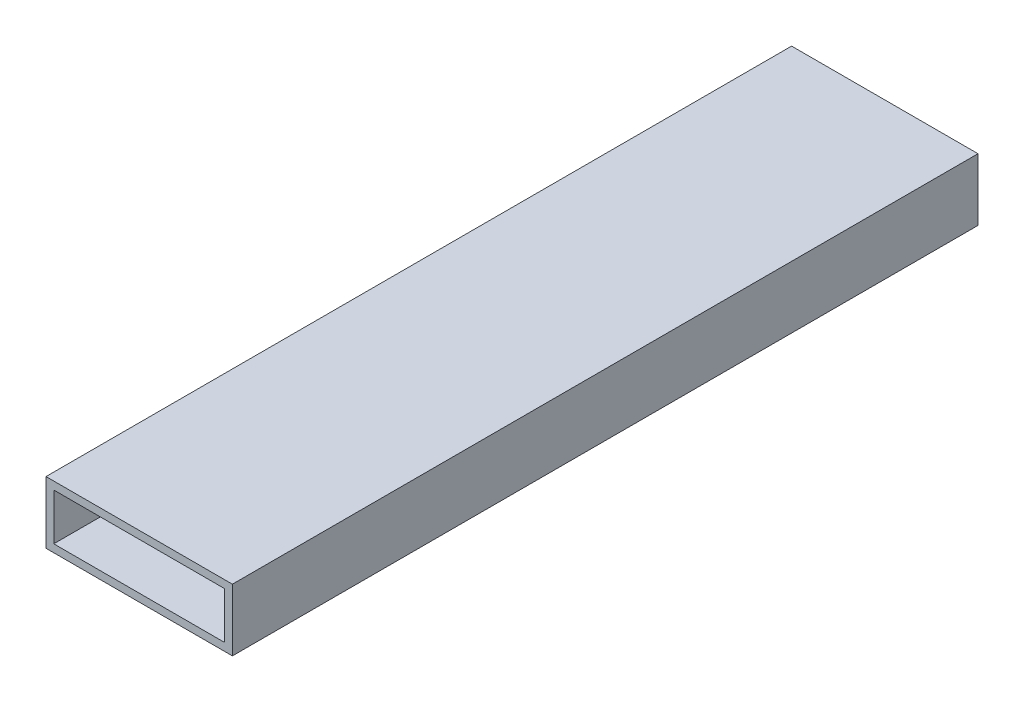
ISO-10303-21;
HEADER;
FILE_DESCRIPTION(('STEP AP214'),'2;1');
FILE_NAME('part.step','',(''),(''),'','','');
FILE_SCHEMA(('AUTOMOTIVE_DESIGN { 1 0 10303 214 1 1 1 1 }'));
ENDSEC;
DATA;
#1=APPLICATION_CONTEXT('core data for automotive mechanical design processes');
#2=APPLICATION_PROTOCOL_DEFINITION('international standard','automotive_design',2000,#1);
#3=PRODUCT_CONTEXT('',#1,'mechanical');
#4=PRODUCT('Part','Part','',(#3));
#5=PRODUCT_RELATED_PRODUCT_CATEGORY('part','',(#4));
#6=PRODUCT_DEFINITION_FORMATION('','',#4);
#7=PRODUCT_DEFINITION_CONTEXT('part definition',#1,'design');
#8=PRODUCT_DEFINITION('design','',#6,#7);
#9=PRODUCT_DEFINITION_SHAPE('','',#8);
#10=(LENGTH_UNIT() NAMED_UNIT(*) SI_UNIT(.MILLI.,.METRE.));
#11=(NAMED_UNIT(*) PLANE_ANGLE_UNIT() SI_UNIT($,.RADIAN.));
#12=(NAMED_UNIT(*) SI_UNIT($,.STERADIAN.) SOLID_ANGLE_UNIT());
#13=UNCERTAINTY_MEASURE_WITH_UNIT(LENGTH_MEASURE(1.E-05),#10,'distance_accuracy_value','');
#14=(GEOMETRIC_REPRESENTATION_CONTEXT(3) GLOBAL_UNCERTAINTY_ASSIGNED_CONTEXT((#13)) GLOBAL_UNIT_ASSIGNED_CONTEXT((#10,
#11,#12)) REPRESENTATION_CONTEXT('',''));
#15=CARTESIAN_POINT('',(0.,0.,0.));
#16=DIRECTION('',(0.,0.,1.));
#17=DIRECTION('',(1.,0.,0.));
#18=AXIS2_PLACEMENT_3D('',#15,#16,#17);
#19=CARTESIAN_POINT('',(38.1,12.7,-152.4));
#20=DIRECTION('',(1.,0.,0.));
#21=DIRECTION('',(0.,0.,-1.));
#22=AXIS2_PLACEMENT_3D('',#19,#20,#21);
#23=PLANE('',#22);
#24=DIRECTION('',(0.,1.,0.));
#25=VECTOR('',#24,1.);
#26=CARTESIAN_POINT('',(38.1,12.7,152.4));
#27=LINE('',#26,#25);
#28=CARTESIAN_POINT('',(38.1,-12.7,152.4));
#29=VERTEX_POINT('',#28);
#30=CARTESIAN_POINT('',(38.1,12.7,152.4));
#31=VERTEX_POINT('',#30);
#32=EDGE_CURVE('E129',#29,#31,#27,.T.);
#33=ORIENTED_EDGE('',*,*,#32,.F.);
#34=DIRECTION('',(0.,0.,1.));
#35=VECTOR('',#34,1.);
#36=CARTESIAN_POINT('',(38.1,-12.7,-152.4));
#37=LINE('',#36,#35);
#38=CARTESIAN_POINT('',(38.1,-12.7,-152.4));
#39=VERTEX_POINT('',#38);
#40=EDGE_CURVE('E11',#39,#29,#37,.T.);
#41=ORIENTED_EDGE('',*,*,#40,.F.);
#42=DIRECTION('',(0.,1.,0.));
#43=VECTOR('',#42,1.);
#44=CARTESIAN_POINT('',(38.1,12.7,-152.4));
#45=LINE('',#44,#43);
#46=CARTESIAN_POINT('',(38.1,12.7,-152.4));
#47=VERTEX_POINT('',#46);
#48=EDGE_CURVE('E133',#39,#47,#45,.T.);
#49=ORIENTED_EDGE('',*,*,#48,.T.);
#50=DIRECTION('',(0.,0.,1.));
#51=VECTOR('',#50,1.);
#52=CARTESIAN_POINT('',(38.1,12.7,-152.4));
#53=LINE('',#52,#51);
#54=EDGE_CURVE('E34',#47,#31,#53,.T.);
#55=ORIENTED_EDGE('',*,*,#54,.T.);
#56=EDGE_LOOP('',(#33,#41,#49,#55));
#57=FACE_BOUND('',#56,.T.);
#58=ADVANCED_FACE('F31',(#57),#23,.T.);
#59=CARTESIAN_POINT('',(-38.1,-12.7,-152.4));
#60=DIRECTION('',(0.,-1.,0.));
#61=DIRECTION('',(0.,0.,-1.));
#62=AXIS2_PLACEMENT_3D('',#59,#60,#61);
#63=PLANE('',#62);
#64=DIRECTION('',(1.,0.,0.));
#65=VECTOR('',#64,1.);
#66=CARTESIAN_POINT('',(-38.1,-12.7,152.4));
#67=LINE('',#66,#65);
#68=CARTESIAN_POINT('',(-38.1,-12.7,152.4));
#69=VERTEX_POINT('',#68);
#70=EDGE_CURVE('E137',#69,#29,#67,.T.);
#71=ORIENTED_EDGE('',*,*,#70,.F.);
#72=DIRECTION('',(0.,0.,1.));
#73=VECTOR('',#72,1.);
#74=CARTESIAN_POINT('',(-38.1,-12.7,-152.4));
#75=LINE('',#74,#73);
#76=CARTESIAN_POINT('',(-38.1,-12.7,-152.4));
#77=VERTEX_POINT('',#76);
#78=EDGE_CURVE('E39',#77,#69,#75,.T.);
#79=ORIENTED_EDGE('',*,*,#78,.F.);
#80=DIRECTION('',(1.,0.,0.));
#81=VECTOR('',#80,1.);
#82=CARTESIAN_POINT('',(-38.1,-12.7,-152.4));
#83=LINE('',#82,#81);
#84=EDGE_CURVE('E143',#77,#39,#83,.T.);
#85=ORIENTED_EDGE('',*,*,#84,.T.);
#86=ORIENTED_EDGE('',*,*,#40,.T.);
#87=EDGE_LOOP('',(#71,#79,#85,#86));
#88=FACE_BOUND('',#87,.T.);
#89=ADVANCED_FACE('F169',(#88),#63,.T.);
#90=CARTESIAN_POINT('',(-38.1,12.7,-152.4));
#91=DIRECTION('',(-1.,0.,0.));
#92=DIRECTION('',(0.,0.,1.));
#93=AXIS2_PLACEMENT_3D('',#90,#91,#92);
#94=PLANE('',#93);
#95=DIRECTION('',(0.,-1.,0.));
#96=VECTOR('',#95,1.);
#97=CARTESIAN_POINT('',(-38.1,12.7,152.4));
#98=LINE('',#97,#96);
#99=CARTESIAN_POINT('',(-38.1,12.7,152.4));
#100=VERTEX_POINT('',#99);
#101=EDGE_CURVE('E151',#100,#69,#98,.T.);
#102=ORIENTED_EDGE('',*,*,#101,.F.);
#103=DIRECTION('',(0.,0.,1.));
#104=VECTOR('',#103,1.);
#105=CARTESIAN_POINT('',(-38.1,12.7,-152.4));
#106=LINE('',#105,#104);
#107=CARTESIAN_POINT('',(-38.1,12.7,-152.4));
#108=VERTEX_POINT('',#107);
#109=EDGE_CURVE('E156',#108,#100,#106,.T.);
#110=ORIENTED_EDGE('',*,*,#109,.F.);
#111=DIRECTION('',(0.,-1.,0.));
#112=VECTOR('',#111,1.);
#113=CARTESIAN_POINT('',(-38.1,12.7,-152.4));
#114=LINE('',#113,#112);
#115=EDGE_CURVE('E140',#108,#77,#114,.T.);
#116=ORIENTED_EDGE('',*,*,#115,.T.);
#117=ORIENTED_EDGE('',*,*,#78,.T.);
#118=EDGE_LOOP('',(#102,#110,#116,#117));
#119=FACE_BOUND('',#118,.T.);
#120=ADVANCED_FACE('F173',(#119),#94,.T.);
#121=CARTESIAN_POINT('',(-38.1,12.7,-152.4));
#122=DIRECTION('',(0.,1.,0.));
#123=DIRECTION('',(0.,0.,1.));
#124=AXIS2_PLACEMENT_3D('',#121,#122,#123);
#125=PLANE('',#124);
#126=DIRECTION('',(-1.,0.,0.));
#127=VECTOR('',#126,1.);
#128=CARTESIAN_POINT('',(-38.1,12.7,152.4));
#129=LINE('',#128,#127);
#130=EDGE_CURVE('E148',#31,#100,#129,.T.);
#131=ORIENTED_EDGE('',*,*,#130,.F.);
#132=ORIENTED_EDGE('',*,*,#54,.F.);
#133=DIRECTION('',(-1.,0.,0.));
#134=VECTOR('',#133,1.);
#135=CARTESIAN_POINT('',(-38.1,12.7,-152.4));
#136=LINE('',#135,#134);
#137=EDGE_CURVE('E136',#47,#108,#136,.T.);
#138=ORIENTED_EDGE('',*,*,#137,.T.);
#139=ORIENTED_EDGE('',*,*,#109,.T.);
#140=EDGE_LOOP('',(#131,#132,#138,#139));
#141=FACE_BOUND('',#140,.T.);
#142=ADVANCED_FACE('F164',(#141),#125,.T.);
#143=CARTESIAN_POINT('',(38.1,-12.7,-152.4));
#144=DIRECTION('',(0.,0.,1.));
#145=DIRECTION('',(1.,0.,0.));
#146=AXIS2_PLACEMENT_3D('',#143,#144,#145);
#147=PLANE('',#146);
#148=DIRECTION('',(0.,-1.,0.));
#149=VECTOR('',#148,1.);
#150=CARTESIAN_POINT('',(-34.925,9.52500000000001,-152.4));
#151=LINE('',#150,#149);
#152=CARTESIAN_POINT('',(-34.925,9.52500000000001,-152.4));
#153=VERTEX_POINT('',#152);
#154=CARTESIAN_POINT('',(-34.925,-9.52499999999999,-152.4));
#155=VERTEX_POINT('',#154);
#156=EDGE_CURVE('E104',#153,#155,#151,.T.);
#157=ORIENTED_EDGE('',*,*,#156,.T.);
#158=DIRECTION('',(1.,0.,0.));
#159=VECTOR('',#158,1.);
#160=CARTESIAN_POINT('',(-34.925,-9.52499999999999,-152.4));
#161=LINE('',#160,#159);
#162=CARTESIAN_POINT('',(34.925,-9.52499999999999,-152.4));
#163=VERTEX_POINT('',#162);
#164=EDGE_CURVE('E98',#155,#163,#161,.T.);
#165=ORIENTED_EDGE('',*,*,#164,.T.);
#166=DIRECTION('',(0.,1.,0.));
#167=VECTOR('',#166,1.);
#168=CARTESIAN_POINT('',(34.925,-9.52499999999999,-152.4));
#169=LINE('',#168,#167);
#170=CARTESIAN_POINT('',(34.925,9.525,-152.4));
#171=VERTEX_POINT('',#170);
#172=EDGE_CURVE('E107',#163,#171,#169,.T.);
#173=ORIENTED_EDGE('',*,*,#172,.T.);
#174=DIRECTION('',(-1.,0.,0.));
#175=VECTOR('',#174,1.);
#176=CARTESIAN_POINT('',(34.925,9.52500000000001,-152.4));
#177=LINE('',#176,#175);
#178=EDGE_CURVE('E47',#171,#153,#177,.T.);
#179=ORIENTED_EDGE('',*,*,#178,.T.);
#180=EDGE_LOOP('',(#157,#165,#173,#179));
#181=FACE_BOUND('',#180,.T.);
#182=ORIENTED_EDGE('',*,*,#48,.F.);
#183=ORIENTED_EDGE('',*,*,#84,.F.);
#184=ORIENTED_EDGE('',*,*,#115,.F.);
#185=ORIENTED_EDGE('',*,*,#137,.F.);
#186=EDGE_LOOP('',(#182,#183,#184,#185));
#187=FACE_BOUND('',#186,.T.);
#188=ADVANCED_FACE('F111',(#181,#187),#147,.F.);
#189=CARTESIAN_POINT('',(38.1,-12.7,152.4));
#190=DIRECTION('',(0.,0.,1.));
#191=DIRECTION('',(1.,0.,0.));
#192=AXIS2_PLACEMENT_3D('',#189,#190,#191);
#193=PLANE('',#192);
#194=DIRECTION('',(1.,0.,0.));
#195=VECTOR('',#194,1.);
#196=CARTESIAN_POINT('',(-34.925,-9.52499999999999,152.4));
#197=LINE('',#196,#195);
#198=CARTESIAN_POINT('',(-34.925,-9.52499999999999,152.4));
#199=VERTEX_POINT('',#198);
#200=CARTESIAN_POINT('',(34.925,-9.52499999999999,152.4));
#201=VERTEX_POINT('',#200);
#202=EDGE_CURVE('E55',#199,#201,#197,.T.);
#203=ORIENTED_EDGE('',*,*,#202,.F.);
#204=DIRECTION('',(0.,-1.,0.));
#205=VECTOR('',#204,1.);
#206=CARTESIAN_POINT('',(-34.925,9.52500000000001,152.4));
#207=LINE('',#206,#205);
#208=CARTESIAN_POINT('',(-34.925,9.52500000000001,152.4));
#209=VERTEX_POINT('',#208);
#210=EDGE_CURVE('E114',#209,#199,#207,.T.);
#211=ORIENTED_EDGE('',*,*,#210,.F.);
#212=DIRECTION('',(-1.,0.,0.));
#213=VECTOR('',#212,1.);
#214=CARTESIAN_POINT('',(34.925,9.52500000000001,152.4));
#215=LINE('',#214,#213);
#216=CARTESIAN_POINT('',(34.925,9.52500000000001,152.4));
#217=VERTEX_POINT('',#216);
#218=EDGE_CURVE('E117',#217,#209,#215,.T.);
#219=ORIENTED_EDGE('',*,*,#218,.F.);
#220=DIRECTION('',(0.,1.,0.));
#221=VECTOR('',#220,1.);
#222=CARTESIAN_POINT('',(34.925,-9.52499999999999,152.4));
#223=LINE('',#222,#221);
#224=EDGE_CURVE('E123',#201,#217,#223,.T.);
#225=ORIENTED_EDGE('',*,*,#224,.F.);
#226=EDGE_LOOP('',(#203,#211,#219,#225));
#227=FACE_BOUND('',#226,.T.);
#228=ORIENTED_EDGE('',*,*,#32,.T.);
#229=ORIENTED_EDGE('',*,*,#130,.T.);
#230=ORIENTED_EDGE('',*,*,#101,.T.);
#231=ORIENTED_EDGE('',*,*,#70,.T.);
#232=EDGE_LOOP('',(#228,#229,#230,#231));
#233=FACE_BOUND('',#232,.T.);
#234=ADVANCED_FACE('F166',(#227,#233),#193,.T.);
#235=CARTESIAN_POINT('',(-34.925,-9.52499999999999,-152.4));
#236=DIRECTION('',(0.,-1.,0.));
#237=DIRECTION('',(0.,0.,-1.));
#238=AXIS2_PLACEMENT_3D('',#235,#236,#237);
#239=PLANE('',#238);
#240=ORIENTED_EDGE('',*,*,#202,.T.);
#241=DIRECTION('',(0.,0.,1.));
#242=VECTOR('',#241,1.);
#243=CARTESIAN_POINT('',(34.925,-9.52499999999999,-152.4));
#244=LINE('',#243,#242);
#245=EDGE_CURVE('E94',#163,#201,#244,.T.);
#246=ORIENTED_EDGE('',*,*,#245,.F.);
#247=ORIENTED_EDGE('',*,*,#164,.F.);
#248=DIRECTION('',(0.,0.,1.));
#249=VECTOR('',#248,1.);
#250=CARTESIAN_POINT('',(-34.925,-9.52499999999999,-152.4));
#251=LINE('',#250,#249);
#252=EDGE_CURVE('E127',#155,#199,#251,.T.);
#253=ORIENTED_EDGE('',*,*,#252,.T.);
#254=EDGE_LOOP('',(#240,#246,#247,#253));
#255=FACE_BOUND('',#254,.T.);
#256=ADVANCED_FACE('F96',(#255),#239,.F.);
#257=CARTESIAN_POINT('',(-34.925,9.52500000000001,-152.4));
#258=DIRECTION('',(-1.,0.,0.));
#259=DIRECTION('',(0.,0.,1.));
#260=AXIS2_PLACEMENT_3D('',#257,#258,#259);
#261=PLANE('',#260);
#262=ORIENTED_EDGE('',*,*,#210,.T.);
#263=ORIENTED_EDGE('',*,*,#252,.F.);
#264=ORIENTED_EDGE('',*,*,#156,.F.);
#265=DIRECTION('',(0.,0.,1.));
#266=VECTOR('',#265,1.);
#267=CARTESIAN_POINT('',(-34.925,9.52500000000001,-152.4));
#268=LINE('',#267,#266);
#269=EDGE_CURVE('E130',#153,#209,#268,.T.);
#270=ORIENTED_EDGE('',*,*,#269,.T.);
#271=EDGE_LOOP('',(#262,#263,#264,#270));
#272=FACE_BOUND('',#271,.T.);
#273=ADVANCED_FACE('F224',(#272),#261,.F.);
#274=CARTESIAN_POINT('',(34.925,9.52500000000001,-152.4));
#275=DIRECTION('',(0.,1.,0.));
#276=DIRECTION('',(0.,0.,1.));
#277=AXIS2_PLACEMENT_3D('',#274,#275,#276);
#278=PLANE('',#277);
#279=ORIENTED_EDGE('',*,*,#218,.T.);
#280=ORIENTED_EDGE('',*,*,#269,.F.);
#281=ORIENTED_EDGE('',*,*,#178,.F.);
#282=DIRECTION('',(0.,0.,1.));
#283=VECTOR('',#282,1.);
#284=CARTESIAN_POINT('',(34.925,9.52500000000001,-152.4));
#285=LINE('',#284,#283);
#286=EDGE_CURVE('E103',#171,#217,#285,.T.);
#287=ORIENTED_EDGE('',*,*,#286,.T.);
#288=EDGE_LOOP('',(#279,#280,#281,#287));
#289=FACE_BOUND('',#288,.T.);
#290=ADVANCED_FACE('F233',(#289),#278,.F.);
#291=CARTESIAN_POINT('',(34.925,-9.52499999999999,-152.4));
#292=DIRECTION('',(1.,0.,0.));
#293=DIRECTION('',(0.,0.,-1.));
#294=AXIS2_PLACEMENT_3D('',#291,#292,#293);
#295=PLANE('',#294);
#296=ORIENTED_EDGE('',*,*,#224,.T.);
#297=ORIENTED_EDGE('',*,*,#286,.F.);
#298=ORIENTED_EDGE('',*,*,#172,.F.);
#299=ORIENTED_EDGE('',*,*,#245,.T.);
#300=EDGE_LOOP('',(#296,#297,#298,#299));
#301=FACE_BOUND('',#300,.T.);
#302=ADVANCED_FACE('F108',(#301),#295,.F.);
#303=CLOSED_SHELL('',(#58,#89,#120,#142,#188,#234,#256,#273,#290,#302));
#304=MANIFOLD_SOLID_BREP('B2',#303);
#305=ADVANCED_BREP_SHAPE_REPRESENTATION('',(#18,#304),#14);
#306=SHAPE_DEFINITION_REPRESENTATION(#9,#305);
ENDSEC;
END-ISO-10303-21;
